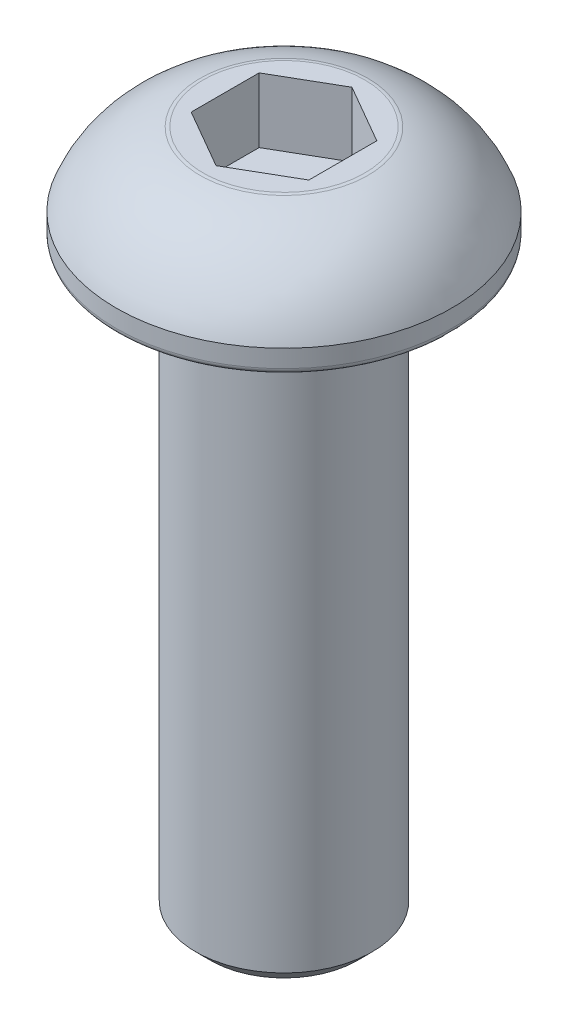
ISO-10303-21;
HEADER;
FILE_DESCRIPTION(('STEP AP214'),'2;1');
FILE_NAME('part.step','',(''),(''),'','','');
FILE_SCHEMA(('AUTOMOTIVE_DESIGN { 1 0 10303 214 1 1 1 1 }'));
ENDSEC;
DATA;
#1=APPLICATION_CONTEXT('core data for automotive mechanical design processes');
#2=APPLICATION_PROTOCOL_DEFINITION('international standard','automotive_design',2000,#1);
#3=PRODUCT_CONTEXT('',#1,'mechanical');
#4=PRODUCT('Part','Part','',(#3));
#5=PRODUCT_RELATED_PRODUCT_CATEGORY('part','',(#4));
#6=PRODUCT_DEFINITION_FORMATION('','',#4);
#7=PRODUCT_DEFINITION_CONTEXT('part definition',#1,'design');
#8=PRODUCT_DEFINITION('design','',#6,#7);
#9=PRODUCT_DEFINITION_SHAPE('','',#8);
#10=(LENGTH_UNIT() NAMED_UNIT(*) SI_UNIT(.MILLI.,.METRE.));
#11=(NAMED_UNIT(*) PLANE_ANGLE_UNIT() SI_UNIT($,.RADIAN.));
#12=(NAMED_UNIT(*) SI_UNIT($,.STERADIAN.) SOLID_ANGLE_UNIT());
#13=UNCERTAINTY_MEASURE_WITH_UNIT(LENGTH_MEASURE(1.E-05),#10,'distance_accuracy_value','');
#14=(GEOMETRIC_REPRESENTATION_CONTEXT(3) GLOBAL_UNCERTAINTY_ASSIGNED_CONTEXT((#13)) GLOBAL_UNIT_ASSIGNED_CONTEXT((#10,
#11,#12)) REPRESENTATION_CONTEXT('',''));
#15=CARTESIAN_POINT('',(0.,0.,0.));
#16=DIRECTION('',(0.,0.,1.));
#17=DIRECTION('',(1.,0.,0.));
#18=AXIS2_PLACEMENT_3D('',#15,#16,#17);
#19=CARTESIAN_POINT('',(0.,0.0999999999999998,0.));
#20=DIRECTION('',(0.,-1.,0.));
#21=DIRECTION('',(0.,0.,-1.));
#22=AXIS2_PLACEMENT_3D('',#19,#20,#21);
#23=TOROIDAL_SURFACE('',#22,2.75,0.0999999999999999);
#24=CARTESIAN_POINT('',(0.,0.,0.));
#25=DIRECTION('',(0.,-1.,0.));
#26=DIRECTION('',(0.,0.,-1.));
#27=AXIS2_PLACEMENT_3D('',#24,#25,#26);
#28=CIRCLE('',#27,2.75);
#29=CARTESIAN_POINT('',(0.,0.,-2.75));
#30=VERTEX_POINT('',#29);
#31=EDGE_CURVE('E136',#30,#30,#28,.T.);
#32=ORIENTED_EDGE('',*,*,#31,.F.);
#33=EDGE_LOOP('',(#32));
#34=FACE_BOUND('',#33,.T.);
#35=CARTESIAN_POINT('',(0.,0.100000000000001,0.));
#36=DIRECTION('',(0.,-1.,0.));
#37=DIRECTION('',(0.,0.,-1.));
#38=AXIS2_PLACEMENT_3D('',#35,#36,#37);
#39=CIRCLE('',#38,2.85);
#40=CARTESIAN_POINT('',(0.,0.100000000000001,-2.85));
#41=VERTEX_POINT('',#40);
#42=EDGE_CURVE('E11',#41,#41,#39,.T.);
#43=ORIENTED_EDGE('',*,*,#42,.T.);
#44=EDGE_LOOP('',(#43));
#45=FACE_BOUND('',#44,.T.);
#46=ADVANCED_FACE('F35',(#34,#45),#23,.T.);
#47=CARTESIAN_POINT('',(0.,-10.,0.));
#48=DIRECTION('',(0.,-1.,0.));
#49=DIRECTION('',(0.,0.,-1.));
#50=AXIS2_PLACEMENT_3D('',#47,#48,#49);
#51=CYLINDRICAL_SURFACE('',#50,2.85);
#52=ORIENTED_EDGE('',*,*,#42,.F.);
#53=EDGE_LOOP('',(#52));
#54=FACE_BOUND('',#53,.T.);
#55=CARTESIAN_POINT('',(0.,0.399999999999999,0.));
#56=DIRECTION('',(0.,-1.,0.));
#57=DIRECTION('',(0.,0.,-1.));
#58=AXIS2_PLACEMENT_3D('',#55,#56,#57);
#59=CIRCLE('',#58,2.85);
#60=CARTESIAN_POINT('',(0.,0.399999999999999,-2.85));
#61=VERTEX_POINT('',#60);
#62=EDGE_CURVE('E42',#61,#61,#59,.T.);
#63=ORIENTED_EDGE('',*,*,#62,.T.);
#64=EDGE_LOOP('',(#63));
#65=FACE_BOUND('',#64,.T.);
#66=ADVANCED_FACE('F164',(#54,#65),#51,.T.);
#67=CARTESIAN_POINT('',(0.,-0.305058043743636,0.));
#68=DIRECTION('',(0.,-1.,0.));
#69=DIRECTION('',(0.,0.,-1.));
#70=AXIS2_PLACEMENT_3D('',#67,#68,#69);
#71=DEGENERATE_TOROIDAL_SURFACE('',#70,0.978398238152038,2.,.T.);
#72=ORIENTED_EDGE('',*,*,#62,.F.);
#73=EDGE_LOOP('',(#72));
#74=FACE_BOUND('',#73,.T.);
#75=CARTESIAN_POINT('',(0.,1.64357972053481,0.));
#76=DIRECTION('',(0.,-1.,0.));
#77=DIRECTION('',(0.,0.,-1.));
#78=AXIS2_PLACEMENT_3D('',#75,#76,#77);
#79=CIRCLE('',#78,1.42874350972477);
#80=CARTESIAN_POINT('',(0.,1.64357972053481,-1.42874350972477));
#81=VERTEX_POINT('',#80);
#82=EDGE_CURVE('E159',#81,#81,#79,.T.);
#83=ORIENTED_EDGE('',*,*,#82,.T.);
#84=EDGE_LOOP('',(#83));
#85=FACE_BOUND('',#84,.T.);
#86=ADVANCED_FACE('F166',(#74,#85),#71,.T.);
#87=CARTESIAN_POINT('',(0.,1.4,0.));
#88=DIRECTION('',(0.,-1.,0.));
#89=DIRECTION('',(0.,0.,-1.));
#90=AXIS2_PLACEMENT_3D('',#87,#88,#89);
#91=TOROIDAL_SURFACE('',#90,1.37245035077818,0.25);
#92=ORIENTED_EDGE('',*,*,#82,.F.);
#93=EDGE_LOOP('',(#92));
#94=FACE_BOUND('',#93,.T.);
#95=CARTESIAN_POINT('',(0.,1.65,0.));
#96=DIRECTION('',(0.,-1.,0.));
#97=DIRECTION('',(0.,0.,-1.));
#98=AXIS2_PLACEMENT_3D('',#95,#96,#97);
#99=CIRCLE('',#98,1.37245035077818);
#100=CARTESIAN_POINT('',(0.,1.65,-1.37245035077818));
#101=VERTEX_POINT('',#100);
#102=EDGE_CURVE('E156',#101,#101,#99,.T.);
#103=ORIENTED_EDGE('',*,*,#102,.T.);
#104=EDGE_LOOP('',(#103));
#105=FACE_BOUND('',#104,.T.);
#106=ADVANCED_FACE('F169',(#94,#105),#91,.T.);
#107=CARTESIAN_POINT('',(-1.37245035077818,1.65,0.));
#108=DIRECTION('',(0.,-1.,0.));
#109=DIRECTION('',(0.,0.,-1.));
#110=AXIS2_PLACEMENT_3D('',#107,#108,#109);
#111=PLANE('',#110);
#112=DIRECTION('',(0.,0.,1.));
#113=VECTOR('',#112,1.);
#114=CARTESIAN_POINT('',(-1.,1.65,-0.577350269189625));
#115=LINE('',#114,#113);
#116=CARTESIAN_POINT('',(-1.,1.65,-0.577350269189625));
#117=VERTEX_POINT('',#116);
#118=CARTESIAN_POINT('',(-1.,1.65,0.577350269189626));
#119=VERTEX_POINT('',#118);
#120=EDGE_CURVE('E123',#117,#119,#115,.T.);
#121=ORIENTED_EDGE('',*,*,#120,.F.);
#122=DIRECTION('',(-0.866025403784438,0.,0.5));
#123=VECTOR('',#122,1.);
#124=CARTESIAN_POINT('',(0.,1.65,-1.15470053837925));
#125=LINE('',#124,#123);
#126=CARTESIAN_POINT('',(0.,1.65,-1.15470053837925));
#127=VERTEX_POINT('',#126);
#128=EDGE_CURVE('E49',#127,#117,#125,.T.);
#129=ORIENTED_EDGE('',*,*,#128,.F.);
#130=DIRECTION('',(-0.866025403784439,0.,-0.5));
#131=VECTOR('',#130,1.);
#132=CARTESIAN_POINT('',(1.,1.65,-0.577350269189626));
#133=LINE('',#132,#131);
#134=CARTESIAN_POINT('',(1.,1.65,-0.577350269189626));
#135=VERTEX_POINT('',#134);
#136=EDGE_CURVE('E132',#135,#127,#133,.T.);
#137=ORIENTED_EDGE('',*,*,#136,.F.);
#138=DIRECTION('',(0.,0.,-1.));
#139=VECTOR('',#138,1.);
#140=CARTESIAN_POINT('',(1.,1.65,0.577350269189625));
#141=LINE('',#140,#139);
#142=CARTESIAN_POINT('',(1.,1.65,0.577350269189625));
#143=VERTEX_POINT('',#142);
#144=EDGE_CURVE('E130',#143,#135,#141,.T.);
#145=ORIENTED_EDGE('',*,*,#144,.F.);
#146=DIRECTION('',(0.866025403784438,0.,-0.5));
#147=VECTOR('',#146,1.);
#148=CARTESIAN_POINT('',(0.,1.65,1.15470053837925));
#149=LINE('',#148,#147);
#150=CARTESIAN_POINT('',(0.,1.65,1.15470053837925));
#151=VERTEX_POINT('',#150);
#152=EDGE_CURVE('E97',#151,#143,#149,.T.);
#153=ORIENTED_EDGE('',*,*,#152,.F.);
#154=DIRECTION('',(0.866025403784439,0.,0.5));
#155=VECTOR('',#154,1.);
#156=CARTESIAN_POINT('',(-1.,1.65,0.577350269189626));
#157=LINE('',#156,#155);
#158=EDGE_CURVE('E126',#119,#151,#157,.T.);
#159=ORIENTED_EDGE('',*,*,#158,.F.);
#160=EDGE_LOOP('',(#121,#129,#137,#145,#153,#159));
#161=FACE_BOUND('',#160,.T.);
#162=ORIENTED_EDGE('',*,*,#102,.F.);
#163=EDGE_LOOP('',(#162));
#164=FACE_BOUND('',#163,.T.);
#165=ADVANCED_FACE('F175',(#161,#164),#111,.F.);
#166=CARTESIAN_POINT('',(-1.25,-10.,0.));
#167=DIRECTION('',(0.,1.,0.));
#168=DIRECTION('',(0.,0.,1.));
#169=AXIS2_PLACEMENT_3D('',#166,#167,#168);
#170=PLANE('',#169);
#171=CARTESIAN_POINT('',(0.,-10.,0.));
#172=DIRECTION('',(0.,-1.,0.));
#173=DIRECTION('',(0.,0.,-1.));
#174=AXIS2_PLACEMENT_3D('',#171,#172,#173);
#175=CIRCLE('',#174,1.25);
#176=CARTESIAN_POINT('',(0.,-10.,-1.25));
#177=VERTEX_POINT('',#176);
#178=EDGE_CURVE('E153',#177,#177,#175,.T.);
#179=ORIENTED_EDGE('',*,*,#178,.T.);
#180=EDGE_LOOP('',(#179));
#181=FACE_BOUND('',#180,.T.);
#182=ADVANCED_FACE('F180',(#181),#170,.F.);
#183=CARTESIAN_POINT('',(0.,-9.75,0.));
#184=DIRECTION('',(0.,1.,0.));
#185=DIRECTION('',(0.,0.,1.));
#186=AXIS2_PLACEMENT_3D('',#183,#184,#185);
#187=CONICAL_SURFACE('',#186,1.5,0.785398163397451);
#188=ORIENTED_EDGE('',*,*,#178,.F.);
#189=EDGE_LOOP('',(#188));
#190=FACE_BOUND('',#189,.T.);
#191=CARTESIAN_POINT('',(0.,-9.75,0.));
#192=DIRECTION('',(0.,-1.,0.));
#193=DIRECTION('',(0.,0.,-1.));
#194=AXIS2_PLACEMENT_3D('',#191,#192,#193);
#195=CIRCLE('',#194,1.5);
#196=CARTESIAN_POINT('',(0.,-9.75,-1.5));
#197=VERTEX_POINT('',#196);
#198=EDGE_CURVE('E150',#197,#197,#195,.T.);
#199=ORIENTED_EDGE('',*,*,#198,.T.);
#200=EDGE_LOOP('',(#199));
#201=FACE_BOUND('',#200,.T.);
#202=ADVANCED_FACE('F186',(#190,#201),#187,.T.);
#203=CARTESIAN_POINT('',(0.,-10.,0.));
#204=DIRECTION('',(0.,-1.,0.));
#205=DIRECTION('',(0.,0.,-1.));
#206=AXIS2_PLACEMENT_3D('',#203,#204,#205);
#207=CYLINDRICAL_SURFACE('',#206,1.5);
#208=ORIENTED_EDGE('',*,*,#198,.F.);
#209=EDGE_LOOP('',(#208));
#210=FACE_BOUND('',#209,.T.);
#211=CARTESIAN_POINT('',(0.,-0.100000000000001,0.));
#212=DIRECTION('',(0.,-1.,0.));
#213=DIRECTION('',(0.,0.,-1.));
#214=AXIS2_PLACEMENT_3D('',#211,#212,#213);
#215=CIRCLE('',#214,1.5);
#216=CARTESIAN_POINT('',(0.,-0.100000000000001,-1.5));
#217=VERTEX_POINT('',#216);
#218=EDGE_CURVE('E147',#217,#217,#215,.T.);
#219=ORIENTED_EDGE('',*,*,#218,.T.);
#220=EDGE_LOOP('',(#219));
#221=FACE_BOUND('',#220,.T.);
#222=ADVANCED_FACE('F212',(#210,#221),#207,.T.);
#223=CARTESIAN_POINT('',(0.,-0.1,0.));
#224=DIRECTION('',(0.,-1.,0.));
#225=DIRECTION('',(0.,0.,-1.));
#226=AXIS2_PLACEMENT_3D('',#223,#224,#225);
#227=TOROIDAL_SURFACE('',#226,1.6,0.1);
#228=ORIENTED_EDGE('',*,*,#218,.F.);
#229=EDGE_LOOP('',(#228));
#230=FACE_BOUND('',#229,.T.);
#231=CARTESIAN_POINT('',(0.,0.,0.));
#232=DIRECTION('',(0.,-1.,0.));
#233=DIRECTION('',(0.,0.,-1.));
#234=AXIS2_PLACEMENT_3D('',#231,#232,#233);
#235=CIRCLE('',#234,1.6);
#236=CARTESIAN_POINT('',(0.,0.,-1.6));
#237=VERTEX_POINT('',#236);
#238=EDGE_CURVE('E144',#237,#237,#235,.T.);
#239=ORIENTED_EDGE('',*,*,#238,.T.);
#240=EDGE_LOOP('',(#239));
#241=FACE_BOUND('',#240,.T.);
#242=ADVANCED_FACE('F203',(#230,#241),#227,.F.);
#243=CARTESIAN_POINT('',(-1.6,0.,0.));
#244=DIRECTION('',(0.,1.,0.));
#245=DIRECTION('',(0.,0.,1.));
#246=AXIS2_PLACEMENT_3D('',#243,#244,#245);
#247=PLANE('',#246);
#248=ORIENTED_EDGE('',*,*,#238,.F.);
#249=EDGE_LOOP('',(#248));
#250=FACE_BOUND('',#249,.T.);
#251=ORIENTED_EDGE('',*,*,#31,.T.);
#252=EDGE_LOOP('',(#251));
#253=FACE_BOUND('',#252,.T.);
#254=ADVANCED_FACE('F200',(#250,#253),#247,.F.);
#255=CARTESIAN_POINT('',(0.,0.55,-1.15470053837925));
#256=DIRECTION('',(-0.5,0.,-0.866025403784438));
#257=DIRECTION('',(-0.866025403784438,0.,0.5));
#258=AXIS2_PLACEMENT_3D('',#255,#256,#257);
#259=PLANE('',#258);
#260=ORIENTED_EDGE('',*,*,#128,.T.);
#261=DIRECTION('',(0.,1.,0.));
#262=VECTOR('',#261,1.);
#263=CARTESIAN_POINT('',(-1.,0.55,-0.577350269189625));
#264=LINE('',#263,#262);
#265=CARTESIAN_POINT('',(-1.,0.55,-0.577350269189625));
#266=VERTEX_POINT('',#265);
#267=EDGE_CURVE('E79',#266,#117,#264,.T.);
#268=ORIENTED_EDGE('',*,*,#267,.F.);
#269=DIRECTION('',(-0.866025403784438,0.,0.5));
#270=VECTOR('',#269,1.);
#271=CARTESIAN_POINT('',(0.,0.55,-1.15470053837925));
#272=LINE('',#271,#270);
#273=CARTESIAN_POINT('',(0.,0.55,-1.15470053837925));
#274=VERTEX_POINT('',#273);
#275=EDGE_CURVE('E134',#274,#266,#272,.T.);
#276=ORIENTED_EDGE('',*,*,#275,.F.);
#277=DIRECTION('',(0.,1.,0.));
#278=VECTOR('',#277,1.);
#279=CARTESIAN_POINT('',(0.,0.55,-1.15470053837925));
#280=LINE('',#279,#278);
#281=EDGE_CURVE('E57',#274,#127,#280,.T.);
#282=ORIENTED_EDGE('',*,*,#281,.T.);
#283=EDGE_LOOP('',(#260,#268,#276,#282));
#284=FACE_BOUND('',#283,.T.);
#285=ADVANCED_FACE('F202',(#284),#259,.F.);
#286=CARTESIAN_POINT('',(1.,0.55,-0.577350269189626));
#287=DIRECTION('',(0.5,0.,-0.866025403784439));
#288=DIRECTION('',(-0.866025403784439,0.,-0.5));
#289=AXIS2_PLACEMENT_3D('',#286,#287,#288);
#290=PLANE('',#289);
#291=ORIENTED_EDGE('',*,*,#136,.T.);
#292=ORIENTED_EDGE('',*,*,#281,.F.);
#293=DIRECTION('',(-0.866025403784439,0.,-0.5));
#294=VECTOR('',#293,1.);
#295=CARTESIAN_POINT('',(1.,0.55,-0.577350269189626));
#296=LINE('',#295,#294);
#297=CARTESIAN_POINT('',(1.,0.55,-0.577350269189626));
#298=VERTEX_POINT('',#297);
#299=EDGE_CURVE('E109',#298,#274,#296,.T.);
#300=ORIENTED_EDGE('',*,*,#299,.F.);
#301=DIRECTION('',(0.,1.,0.));
#302=VECTOR('',#301,1.);
#303=CARTESIAN_POINT('',(1.,0.55,-0.577350269189626));
#304=LINE('',#303,#302);
#305=EDGE_CURVE('E101',#298,#135,#304,.T.);
#306=ORIENTED_EDGE('',*,*,#305,.T.);
#307=EDGE_LOOP('',(#291,#292,#300,#306));
#308=FACE_BOUND('',#307,.T.);
#309=ADVANCED_FACE('F210',(#308),#290,.F.);
#310=CARTESIAN_POINT('',(1.,0.55,0.577350269189625));
#311=DIRECTION('',(1.,0.,0.));
#312=DIRECTION('',(0.,0.,-1.));
#313=AXIS2_PLACEMENT_3D('',#310,#311,#312);
#314=PLANE('',#313);
#315=ORIENTED_EDGE('',*,*,#144,.T.);
#316=ORIENTED_EDGE('',*,*,#305,.F.);
#317=DIRECTION('',(0.,0.,-1.));
#318=VECTOR('',#317,1.);
#319=CARTESIAN_POINT('',(1.,0.55,0.577350269189625));
#320=LINE('',#319,#318);
#321=CARTESIAN_POINT('',(1.,0.55,0.577350269189625));
#322=VERTEX_POINT('',#321);
#323=EDGE_CURVE('E105',#322,#298,#320,.T.);
#324=ORIENTED_EDGE('',*,*,#323,.F.);
#325=DIRECTION('',(0.,1.,0.));
#326=VECTOR('',#325,1.);
#327=CARTESIAN_POINT('',(1.,0.55,0.577350269189625));
#328=LINE('',#327,#326);
#329=EDGE_CURVE('E90',#322,#143,#328,.T.);
#330=ORIENTED_EDGE('',*,*,#329,.T.);
#331=EDGE_LOOP('',(#315,#316,#324,#330));
#332=FACE_BOUND('',#331,.T.);
#333=ADVANCED_FACE('F106',(#332),#314,.F.);
#334=CARTESIAN_POINT('',(0.,0.55,1.15470053837925));
#335=DIRECTION('',(0.5,0.,0.866025403784438));
#336=DIRECTION('',(0.866025403784438,0.,-0.5));
#337=AXIS2_PLACEMENT_3D('',#334,#335,#336);
#338=PLANE('',#337);
#339=ORIENTED_EDGE('',*,*,#152,.T.);
#340=ORIENTED_EDGE('',*,*,#329,.F.);
#341=DIRECTION('',(0.866025403784438,0.,-0.5));
#342=VECTOR('',#341,1.);
#343=CARTESIAN_POINT('',(0.,0.55,1.15470053837925));
#344=LINE('',#343,#342);
#345=CARTESIAN_POINT('',(0.,0.55,1.15470053837925));
#346=VERTEX_POINT('',#345);
#347=EDGE_CURVE('E94',#346,#322,#344,.T.);
#348=ORIENTED_EDGE('',*,*,#347,.F.);
#349=DIRECTION('',(0.,1.,0.));
#350=VECTOR('',#349,1.);
#351=CARTESIAN_POINT('',(0.,0.55,1.15470053837925));
#352=LINE('',#351,#350);
#353=EDGE_CURVE('E102',#346,#151,#352,.T.);
#354=ORIENTED_EDGE('',*,*,#353,.T.);
#355=EDGE_LOOP('',(#339,#340,#348,#354));
#356=FACE_BOUND('',#355,.T.);
#357=ADVANCED_FACE('F92',(#356),#338,.F.);
#358=CARTESIAN_POINT('',(-1.,0.55,0.577350269189626));
#359=DIRECTION('',(-0.5,0.,0.866025403784438));
#360=DIRECTION('',(0.866025403784439,0.,0.5));
#361=AXIS2_PLACEMENT_3D('',#358,#359,#360);
#362=PLANE('',#361);
#363=ORIENTED_EDGE('',*,*,#158,.T.);
#364=ORIENTED_EDGE('',*,*,#353,.F.);
#365=DIRECTION('',(0.866025403784439,0.,0.5));
#366=VECTOR('',#365,1.);
#367=CARTESIAN_POINT('',(-1.,0.55,0.577350269189626));
#368=LINE('',#367,#366);
#369=CARTESIAN_POINT('',(-1.,0.55,0.577350269189626));
#370=VERTEX_POINT('',#369);
#371=EDGE_CURVE('E115',#370,#346,#368,.T.);
#372=ORIENTED_EDGE('',*,*,#371,.F.);
#373=DIRECTION('',(0.,1.,0.));
#374=VECTOR('',#373,1.);
#375=CARTESIAN_POINT('',(-1.,0.55,0.577350269189626));
#376=LINE('',#375,#374);
#377=EDGE_CURVE('E139',#370,#119,#376,.T.);
#378=ORIENTED_EDGE('',*,*,#377,.T.);
#379=EDGE_LOOP('',(#363,#364,#372,#378));
#380=FACE_BOUND('',#379,.T.);
#381=ADVANCED_FACE('F282',(#380),#362,.F.);
#382=CARTESIAN_POINT('',(-1.,0.55,-0.577350269189625));
#383=DIRECTION('',(-1.,0.,0.));
#384=DIRECTION('',(0.,0.,1.));
#385=AXIS2_PLACEMENT_3D('',#382,#383,#384);
#386=PLANE('',#385);
#387=ORIENTED_EDGE('',*,*,#120,.T.);
#388=ORIENTED_EDGE('',*,*,#377,.F.);
#389=DIRECTION('',(0.,0.,1.));
#390=VECTOR('',#389,1.);
#391=CARTESIAN_POINT('',(-1.,0.55,-0.577350269189625));
#392=LINE('',#391,#390);
#393=EDGE_CURVE('E117',#266,#370,#392,.T.);
#394=ORIENTED_EDGE('',*,*,#393,.F.);
#395=ORIENTED_EDGE('',*,*,#267,.T.);
#396=EDGE_LOOP('',(#387,#388,#394,#395));
#397=FACE_BOUND('',#396,.T.);
#398=ADVANCED_FACE('F291',(#397),#386,.F.);
#399=CARTESIAN_POINT('',(0.,0.55,0.));
#400=DIRECTION('',(0.,1.,0.));
#401=DIRECTION('',(0.,0.,1.));
#402=AXIS2_PLACEMENT_3D('',#399,#400,#401);
#403=PLANE('',#402);
#404=ORIENTED_EDGE('',*,*,#275,.T.);
#405=ORIENTED_EDGE('',*,*,#393,.T.);
#406=ORIENTED_EDGE('',*,*,#371,.T.);
#407=ORIENTED_EDGE('',*,*,#347,.T.);
#408=ORIENTED_EDGE('',*,*,#323,.T.);
#409=ORIENTED_EDGE('',*,*,#299,.T.);
#410=EDGE_LOOP('',(#404,#405,#406,#407,#408,#409));
#411=FACE_BOUND('',#410,.T.);
#412=ADVANCED_FACE('F112',(#411),#403,.T.);
#413=CLOSED_SHELL('',(#46,#66,#86,#106,#165,#182,#202,#222,#242,#254,#285,#309,#333,#357,#381,
#398,#412));
#414=MANIFOLD_SOLID_BREP('B2',#413);
#415=ADVANCED_BREP_SHAPE_REPRESENTATION('',(#18,#414),#14);
#416=SHAPE_DEFINITION_REPRESENTATION(#9,#415);
ENDSEC;
END-ISO-10303-21;
